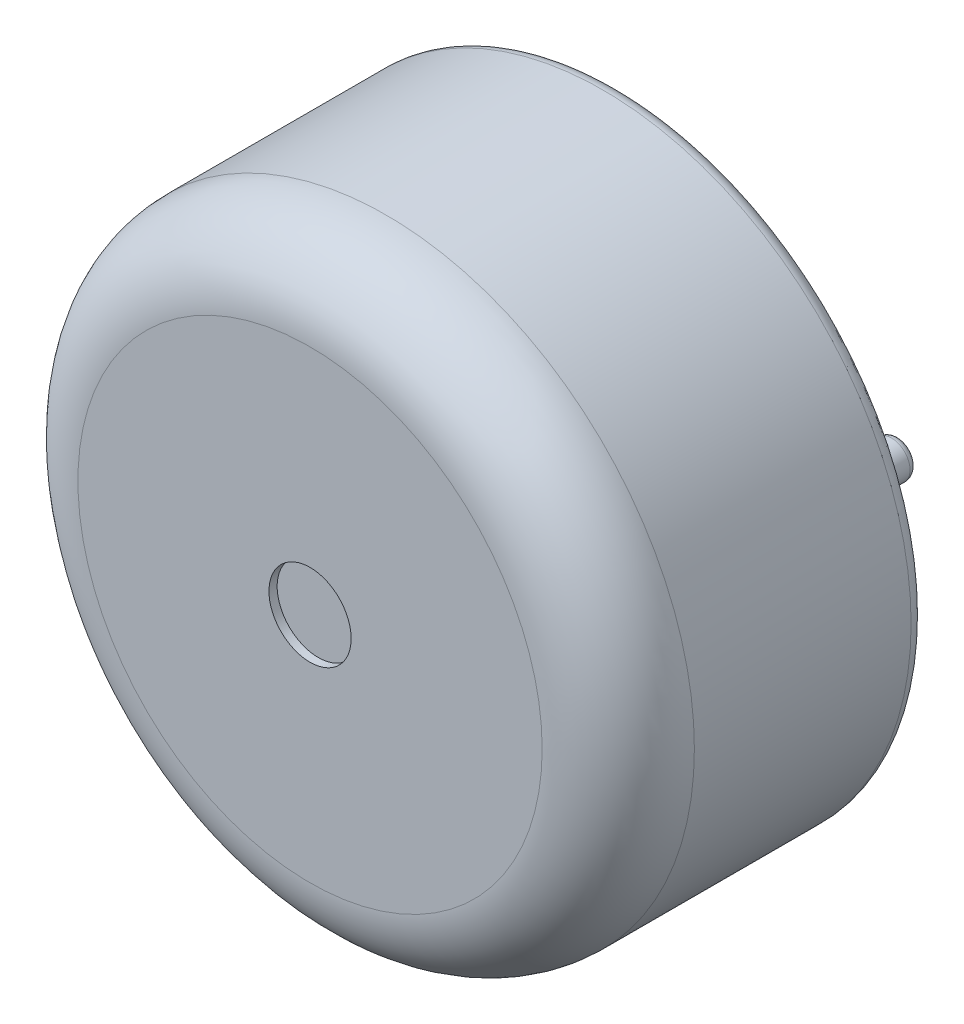
ISO-10303-21;
HEADER;
FILE_DESCRIPTION(('STEP AP214'),'2;1');
FILE_NAME('part.step','',(''),(''),'','','');
FILE_SCHEMA(('AUTOMOTIVE_DESIGN { 1 0 10303 214 1 1 1 1 }'));
ENDSEC;
DATA;
#1=APPLICATION_CONTEXT('core data for automotive mechanical design processes');
#2=APPLICATION_PROTOCOL_DEFINITION('international standard','automotive_design',2000,#1);
#3=PRODUCT_CONTEXT('',#1,'mechanical');
#4=PRODUCT('Part','Part','',(#3));
#5=PRODUCT_RELATED_PRODUCT_CATEGORY('part','',(#4));
#6=PRODUCT_DEFINITION_FORMATION('','',#4);
#7=PRODUCT_DEFINITION_CONTEXT('part definition',#1,'design');
#8=PRODUCT_DEFINITION('design','',#6,#7);
#9=PRODUCT_DEFINITION_SHAPE('','',#8);
#10=(LENGTH_UNIT() NAMED_UNIT(*) SI_UNIT(.MILLI.,.METRE.));
#11=(NAMED_UNIT(*) PLANE_ANGLE_UNIT() SI_UNIT($,.RADIAN.));
#12=(NAMED_UNIT(*) SI_UNIT($,.STERADIAN.) SOLID_ANGLE_UNIT());
#13=UNCERTAINTY_MEASURE_WITH_UNIT(LENGTH_MEASURE(1.E-05),#10,'distance_accuracy_value','');
#14=(GEOMETRIC_REPRESENTATION_CONTEXT(3) GLOBAL_UNCERTAINTY_ASSIGNED_CONTEXT((#13)) GLOBAL_UNIT_ASSIGNED_CONTEXT((#10,
#11,#12)) REPRESENTATION_CONTEXT('',''));
#15=CARTESIAN_POINT('',(0.,0.,0.));
#16=DIRECTION('',(0.,0.,1.));
#17=DIRECTION('',(1.,0.,0.));
#18=AXIS2_PLACEMENT_3D('',#15,#16,#17);
#19=CARTESIAN_POINT('',(7.6,0.,-3.));
#20=DIRECTION('',(0.,0.,1.));
#21=DIRECTION('',(1.,0.,0.));
#22=AXIS2_PLACEMENT_3D('',#19,#20,#21);
#23=PLANE('',#22);
#24=CARTESIAN_POINT('',(7.6,0.,-3.));
#25=DIRECTION('',(0.,0.,1.));
#26=DIRECTION('',(1.,0.,0.));
#27=AXIS2_PLACEMENT_3D('',#24,#25,#26);
#28=CIRCLE('',#27,0.27);
#29=CARTESIAN_POINT('',(7.87,0.,-3.));
#30=VERTEX_POINT('',#29);
#31=EDGE_CURVE('E10',#30,#30,#28,.T.);
#32=ORIENTED_EDGE('',*,*,#31,.F.);
#33=EDGE_LOOP('',(#32));
#34=FACE_BOUND('',#33,.T.);
#35=ADVANCED_FACE('F15',(#34),#23,.F.);
#36=CARTESIAN_POINT('',(0.,0.,-3.));
#37=DIRECTION('',(0.,0.,1.));
#38=DIRECTION('',(1.,0.,0.));
#39=AXIS2_PLACEMENT_3D('',#36,#37,#38);
#40=PLANE('',#39);
#41=CARTESIAN_POINT('',(0.,0.,-3.));
#42=DIRECTION('',(0.,0.,1.));
#43=DIRECTION('',(1.,0.,0.));
#44=AXIS2_PLACEMENT_3D('',#41,#42,#43);
#45=CIRCLE('',#44,0.27);
#46=CARTESIAN_POINT('',(0.27,0.,-3.));
#47=VERTEX_POINT('',#46);
#48=EDGE_CURVE('E22',#47,#47,#45,.T.);
#49=ORIENTED_EDGE('',*,*,#48,.F.);
#50=EDGE_LOOP('',(#49));
#51=FACE_BOUND('',#50,.T.);
#52=ADVANCED_FACE('F98',(#51),#40,.F.);
#53=CARTESIAN_POINT('',(3.8,0.,7.33));
#54=DIRECTION('',(0.,0.,1.));
#55=DIRECTION('',(1.,0.,0.));
#56=AXIS2_PLACEMENT_3D('',#53,#54,#55);
#57=PLANE('',#56);
#58=CARTESIAN_POINT('',(3.8,0.,7.33));
#59=DIRECTION('',(0.,0.,1.));
#60=DIRECTION('',(1.,0.,0.));
#61=AXIS2_PLACEMENT_3D('',#58,#59,#60);
#62=CIRCLE('',#61,1.);
#63=CARTESIAN_POINT('',(4.8,0.,7.33));
#64=VERTEX_POINT('',#63);
#65=EDGE_CURVE('E30',#64,#64,#62,.T.);
#66=ORIENTED_EDGE('',*,*,#65,.T.);
#67=EDGE_LOOP('',(#66));
#68=FACE_BOUND('',#67,.T.);
#69=ADVANCED_FACE('F93',(#68),#57,.T.);
#70=CARTESIAN_POINT('',(7.6,0.,-2.82));
#71=DIRECTION('',(0.,0.,-1.));
#72=DIRECTION('',(1.,0.,0.));
#73=AXIS2_PLACEMENT_3D('',#70,#71,#72);
#74=TOROIDAL_SURFACE('',#73,0.27,0.18);
#75=ORIENTED_EDGE('',*,*,#31,.T.);
#76=EDGE_LOOP('',(#75));
#77=FACE_BOUND('',#76,.T.);
#78=CARTESIAN_POINT('',(7.6,0.,-2.82));
#79=DIRECTION('',(0.,0.,1.));
#80=DIRECTION('',(1.,0.,0.));
#81=AXIS2_PLACEMENT_3D('',#78,#79,#80);
#82=CIRCLE('',#81,0.45);
#83=CARTESIAN_POINT('',(8.05,0.,-2.82));
#84=VERTEX_POINT('',#83);
#85=EDGE_CURVE('E37',#84,#84,#82,.T.);
#86=ORIENTED_EDGE('',*,*,#85,.F.);
#87=EDGE_LOOP('',(#86));
#88=FACE_BOUND('',#87,.T.);
#89=ADVANCED_FACE('F82',(#77,#88),#74,.T.);
#90=CARTESIAN_POINT('',(0.,0.,-2.82));
#91=DIRECTION('',(0.,0.,-1.));
#92=DIRECTION('',(1.,0.,0.));
#93=AXIS2_PLACEMENT_3D('',#90,#91,#92);
#94=TOROIDAL_SURFACE('',#93,0.27,0.18);
#95=ORIENTED_EDGE('',*,*,#48,.T.);
#96=EDGE_LOOP('',(#95));
#97=FACE_BOUND('',#96,.T.);
#98=CARTESIAN_POINT('',(0.,0.,-2.82));
#99=DIRECTION('',(0.,0.,1.));
#100=DIRECTION('',(1.,0.,0.));
#101=AXIS2_PLACEMENT_3D('',#98,#99,#100);
#102=CIRCLE('',#101,0.45);
#103=CARTESIAN_POINT('',(0.45,0.,-2.82));
#104=VERTEX_POINT('',#103);
#105=EDGE_CURVE('E43',#104,#104,#102,.T.);
#106=ORIENTED_EDGE('',*,*,#105,.F.);
#107=EDGE_LOOP('',(#106));
#108=FACE_BOUND('',#107,.T.);
#109=ADVANCED_FACE('F79',(#97,#108),#94,.T.);
#110=CARTESIAN_POINT('',(3.8,0.,1.53));
#111=DIRECTION('',(0.,0.,-1.));
#112=DIRECTION('',(1.,0.,0.));
#113=AXIS2_PLACEMENT_3D('',#110,#111,#112);
#114=CYLINDRICAL_SURFACE('',#113,1.);
#115=CARTESIAN_POINT('',(3.8,0.,7.53));
#116=DIRECTION('',(0.,0.,-1.));
#117=DIRECTION('',(1.,0.,0.));
#118=AXIS2_PLACEMENT_3D('',#115,#116,#117);
#119=CIRCLE('',#118,1.);
#120=CARTESIAN_POINT('',(4.8,0.,7.53));
#121=VERTEX_POINT('',#120);
#122=EDGE_CURVE('E40',#121,#121,#119,.T.);
#123=ORIENTED_EDGE('',*,*,#122,.F.);
#124=EDGE_LOOP('',(#123));
#125=FACE_BOUND('',#124,.T.);
#126=ORIENTED_EDGE('',*,*,#65,.F.);
#127=EDGE_LOOP('',(#126));
#128=FACE_BOUND('',#127,.T.);
#129=ADVANCED_FACE('F81',(#125,#128),#114,.F.);
#130=CARTESIAN_POINT('',(7.6,0.,1.03));
#131=DIRECTION('',(0.,0.,1.));
#132=DIRECTION('',(1.,0.,0.));
#133=AXIS2_PLACEMENT_3D('',#130,#131,#132);
#134=CYLINDRICAL_SURFACE('',#133,0.45);
#135=ORIENTED_EDGE('',*,*,#85,.T.);
#136=EDGE_LOOP('',(#135));
#137=FACE_BOUND('',#136,.T.);
#138=CARTESIAN_POINT('',(7.6,0.,0.03));
#139=DIRECTION('',(0.,0.,1.));
#140=DIRECTION('',(1.,0.,0.));
#141=AXIS2_PLACEMENT_3D('',#138,#139,#140);
#142=CIRCLE('',#141,0.45);
#143=CARTESIAN_POINT('',(8.05,0.,0.03));
#144=VERTEX_POINT('',#143);
#145=EDGE_CURVE('E44',#144,#144,#142,.T.);
#146=ORIENTED_EDGE('',*,*,#145,.F.);
#147=EDGE_LOOP('',(#146));
#148=FACE_BOUND('',#147,.T.);
#149=ADVANCED_FACE('F90',(#137,#148),#134,.T.);
#150=CARTESIAN_POINT('',(0.,0.,1.03));
#151=DIRECTION('',(0.,0.,1.));
#152=DIRECTION('',(1.,0.,0.));
#153=AXIS2_PLACEMENT_3D('',#150,#151,#152);
#154=CYLINDRICAL_SURFACE('',#153,0.45);
#155=ORIENTED_EDGE('',*,*,#105,.T.);
#156=EDGE_LOOP('',(#155));
#157=FACE_BOUND('',#156,.T.);
#158=CARTESIAN_POINT('',(0.,0.,0.03));
#159=DIRECTION('',(0.,0.,1.));
#160=DIRECTION('',(1.,0.,0.));
#161=AXIS2_PLACEMENT_3D('',#158,#159,#160);
#162=CIRCLE('',#161,0.45);
#163=CARTESIAN_POINT('',(0.45,0.,0.03));
#164=VERTEX_POINT('',#163);
#165=EDGE_CURVE('E47',#164,#164,#162,.T.);
#166=ORIENTED_EDGE('',*,*,#165,.F.);
#167=EDGE_LOOP('',(#166));
#168=FACE_BOUND('',#167,.T.);
#169=ADVANCED_FACE('F76',(#157,#168),#154,.T.);
#170=CARTESIAN_POINT('',(3.8,0.,7.53));
#171=DIRECTION('',(0.,0.,1.));
#172=DIRECTION('',(0.,-1.,0.));
#173=AXIS2_PLACEMENT_3D('',#170,#171,#172);
#174=PLANE('',#173);
#175=ORIENTED_EDGE('',*,*,#122,.T.);
#176=EDGE_LOOP('',(#175));
#177=FACE_BOUND('',#176,.T.);
#178=CARTESIAN_POINT('',(3.8,0.,7.53));
#179=DIRECTION('',(0.,0.,1.));
#180=DIRECTION('',(1.,0.,0.));
#181=AXIS2_PLACEMENT_3D('',#178,#179,#180);
#182=CIRCLE('',#181,5.648148148148);
#183=CARTESIAN_POINT('',(9.448148148148,0.,7.53));
#184=VERTEX_POINT('',#183);
#185=EDGE_CURVE('E52',#184,#184,#182,.T.);
#186=ORIENTED_EDGE('',*,*,#185,.T.);
#187=EDGE_LOOP('',(#186));
#188=FACE_BOUND('',#187,.T.);
#189=ADVANCED_FACE('F123',(#177,#188),#174,.T.);
#190=CARTESIAN_POINT('',(3.8,0.,0.03));
#191=DIRECTION('',(0.,0.,1.));
#192=DIRECTION('',(0.,-1.,0.));
#193=AXIS2_PLACEMENT_3D('',#190,#191,#192);
#194=PLANE('',#193);
#195=ORIENTED_EDGE('',*,*,#145,.T.);
#196=EDGE_LOOP('',(#195));
#197=FACE_BOUND('',#196,.T.);
#198=ORIENTED_EDGE('',*,*,#165,.T.);
#199=EDGE_LOOP('',(#198));
#200=FACE_BOUND('',#199,.T.);
#201=CARTESIAN_POINT('',(3.8,0.,0.03));
#202=DIRECTION('',(0.,0.,1.));
#203=DIRECTION('',(1.,0.,0.));
#204=AXIS2_PLACEMENT_3D('',#201,#202,#203);
#205=CIRCLE('',#204,7.125);
#206=CARTESIAN_POINT('',(10.925,0.,0.03));
#207=VERTEX_POINT('',#206);
#208=EDGE_CURVE('E56',#207,#207,#205,.T.);
#209=ORIENTED_EDGE('',*,*,#208,.F.);
#210=EDGE_LOOP('',(#209));
#211=FACE_BOUND('',#210,.T.);
#212=ADVANCED_FACE('F126',(#197,#200,#211),#194,.F.);
#213=CARTESIAN_POINT('',(3.8,0.,5.678148148148));
#214=DIRECTION('',(0.,0.,1.));
#215=DIRECTION('',(1.,0.,0.));
#216=AXIS2_PLACEMENT_3D('',#213,#214,#215);
#217=TOROIDAL_SURFACE('',#216,5.648148148148,1.851851851852);
#218=ORIENTED_EDGE('',*,*,#185,.F.);
#219=EDGE_LOOP('',(#218));
#220=FACE_BOUND('',#219,.T.);
#221=CARTESIAN_POINT('',(3.8,0.,5.678148148148));
#222=DIRECTION('',(0.,0.,1.));
#223=DIRECTION('',(1.,0.,0.));
#224=AXIS2_PLACEMENT_3D('',#221,#222,#223);
#225=CIRCLE('',#224,7.5);
#226=CARTESIAN_POINT('',(11.3,0.,5.678148148148));
#227=VERTEX_POINT('',#226);
#228=EDGE_CURVE('E60',#227,#227,#225,.T.);
#229=ORIENTED_EDGE('',*,*,#228,.T.);
#230=EDGE_LOOP('',(#229));
#231=FACE_BOUND('',#230,.T.);
#232=ADVANCED_FACE('F134',(#220,#231),#217,.T.);
#233=CARTESIAN_POINT('',(3.8,0.,0.405));
#234=DIRECTION('',(0.,0.,-1.));
#235=DIRECTION('',(1.,0.,0.));
#236=AXIS2_PLACEMENT_3D('',#233,#234,#235);
#237=TOROIDAL_SURFACE('',#236,7.125,0.375);
#238=ORIENTED_EDGE('',*,*,#208,.T.);
#239=EDGE_LOOP('',(#238));
#240=FACE_BOUND('',#239,.T.);
#241=CARTESIAN_POINT('',(3.8,0.,0.405));
#242=DIRECTION('',(0.,0.,1.));
#243=DIRECTION('',(1.,0.,0.));
#244=AXIS2_PLACEMENT_3D('',#241,#242,#243);
#245=CIRCLE('',#244,7.5);
#246=CARTESIAN_POINT('',(11.3,0.,0.405));
#247=VERTEX_POINT('',#246);
#248=EDGE_CURVE('E64',#247,#247,#245,.T.);
#249=ORIENTED_EDGE('',*,*,#248,.F.);
#250=EDGE_LOOP('',(#249));
#251=FACE_BOUND('',#250,.T.);
#252=ADVANCED_FACE('F142',(#240,#251),#237,.T.);
#253=CARTESIAN_POINT('',(3.8,0.,0.03));
#254=DIRECTION('',(0.,0.,-1.));
#255=DIRECTION('',(1.,0.,0.));
#256=AXIS2_PLACEMENT_3D('',#253,#254,#255);
#257=CYLINDRICAL_SURFACE('',#256,7.5);
#258=ORIENTED_EDGE('',*,*,#228,.F.);
#259=EDGE_LOOP('',(#258));
#260=FACE_BOUND('',#259,.T.);
#261=ORIENTED_EDGE('',*,*,#248,.T.);
#262=EDGE_LOOP('',(#261));
#263=FACE_BOUND('',#262,.T.);
#264=ADVANCED_FACE('F150',(#260,#263),#257,.T.);
#265=CLOSED_SHELL('',(#35,#52,#69,#89,#109,#129,#149,#169,#189,#212,#232,#252,#264));
#266=MANIFOLD_SOLID_BREP('B1',#265);
#267=ADVANCED_BREP_SHAPE_REPRESENTATION('',(#18,#266),#14);
#268=SHAPE_DEFINITION_REPRESENTATION(#9,#267);
ENDSEC;
END-ISO-10303-21;
